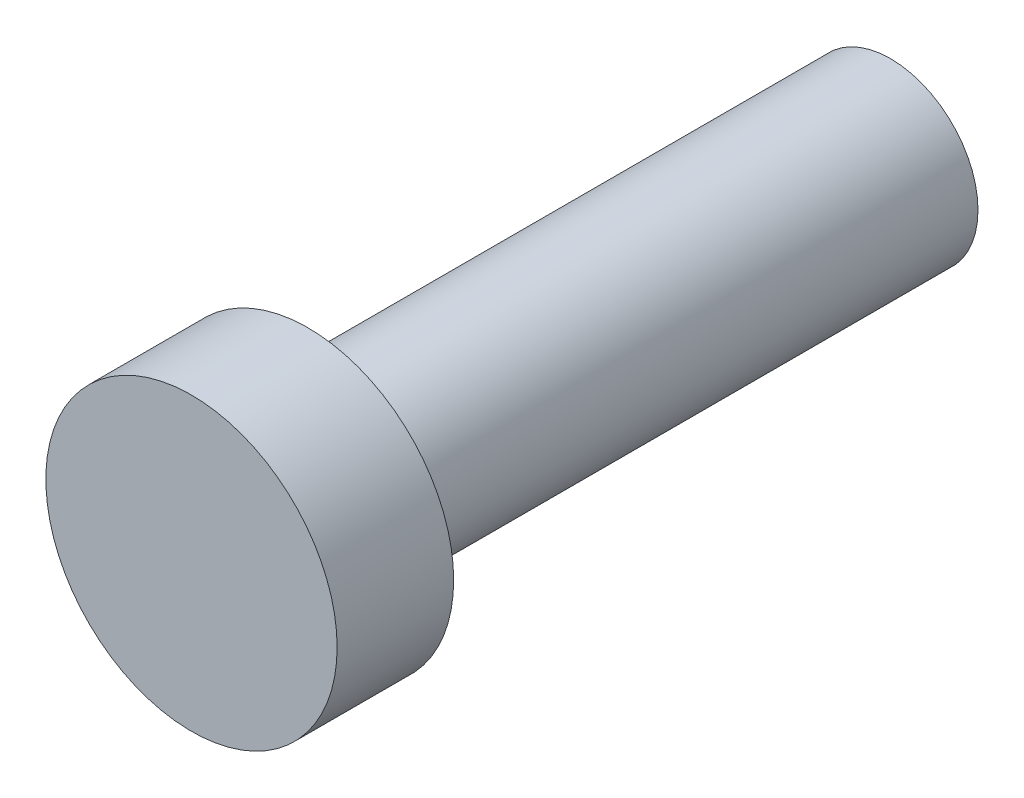
ISO-10303-21;
HEADER;
FILE_DESCRIPTION(('STEP AP214'),'2;1');
FILE_NAME('part.step','',(''),(''),'','','');
FILE_SCHEMA(('AUTOMOTIVE_DESIGN { 1 0 10303 214 1 1 1 1 }'));
ENDSEC;
DATA;
#1=APPLICATION_CONTEXT('core data for automotive mechanical design processes');
#2=APPLICATION_PROTOCOL_DEFINITION('international standard','automotive_design',2000,#1);
#3=PRODUCT_CONTEXT('',#1,'mechanical');
#4=PRODUCT('Part','Part','',(#3));
#5=PRODUCT_RELATED_PRODUCT_CATEGORY('part','',(#4));
#6=PRODUCT_DEFINITION_FORMATION('','',#4);
#7=PRODUCT_DEFINITION_CONTEXT('part definition',#1,'design');
#8=PRODUCT_DEFINITION('design','',#6,#7);
#9=PRODUCT_DEFINITION_SHAPE('','',#8);
#10=(LENGTH_UNIT() NAMED_UNIT(*) SI_UNIT(.MILLI.,.METRE.));
#11=(NAMED_UNIT(*) PLANE_ANGLE_UNIT() SI_UNIT($,.RADIAN.));
#12=(NAMED_UNIT(*) SI_UNIT($,.STERADIAN.) SOLID_ANGLE_UNIT());
#13=UNCERTAINTY_MEASURE_WITH_UNIT(LENGTH_MEASURE(1.E-05),#10,'distance_accuracy_value','');
#14=(GEOMETRIC_REPRESENTATION_CONTEXT(3) GLOBAL_UNCERTAINTY_ASSIGNED_CONTEXT((#13)) GLOBAL_UNIT_ASSIGNED_CONTEXT((#10,
#11,#12)) REPRESENTATION_CONTEXT('',''));
#15=CARTESIAN_POINT('',(0.,0.,0.));
#16=DIRECTION('',(0.,0.,1.));
#17=DIRECTION('',(1.,0.,0.));
#18=AXIS2_PLACEMENT_3D('',#15,#16,#17);
#19=CARTESIAN_POINT('',(0.,0.,-10.));
#20=DIRECTION('',(0.,0.,1.));
#21=DIRECTION('',(1.,0.,0.));
#22=AXIS2_PLACEMENT_3D('',#19,#20,#21);
#23=CYLINDRICAL_SURFACE('',#22,1.5);
#24=CARTESIAN_POINT('',(0.,0.,-10.));
#25=DIRECTION('',(0.,0.,1.));
#26=DIRECTION('',(1.,0.,0.));
#27=AXIS2_PLACEMENT_3D('',#24,#25,#26);
#28=CIRCLE('',#27,1.5);
#29=CARTESIAN_POINT('',(1.5,0.,-10.));
#30=VERTEX_POINT('',#29);
#31=EDGE_CURVE('E10',#30,#30,#28,.T.);
#32=ORIENTED_EDGE('',*,*,#31,.T.);
#33=EDGE_LOOP('',(#32));
#34=FACE_BOUND('',#33,.T.);
#35=CARTESIAN_POINT('',(0.,0.,0.));
#36=DIRECTION('',(0.,0.,1.));
#37=DIRECTION('',(1.,0.,0.));
#38=AXIS2_PLACEMENT_3D('',#35,#36,#37);
#39=CIRCLE('',#38,1.5);
#40=CARTESIAN_POINT('',(1.5,0.,0.));
#41=VERTEX_POINT('',#40);
#42=EDGE_CURVE('E44',#41,#41,#39,.T.);
#43=ORIENTED_EDGE('',*,*,#42,.F.);
#44=EDGE_LOOP('',(#43));
#45=FACE_BOUND('',#44,.T.);
#46=ADVANCED_FACE('F41',(#34,#45),#23,.T.);
#47=CARTESIAN_POINT('',(0.,0.,-10.));
#48=DIRECTION('',(0.,0.,1.));
#49=DIRECTION('',(1.,0.,0.));
#50=AXIS2_PLACEMENT_3D('',#47,#48,#49);
#51=PLANE('',#50);
#52=ORIENTED_EDGE('',*,*,#31,.F.);
#53=EDGE_LOOP('',(#52));
#54=FACE_BOUND('',#53,.T.);
#55=ADVANCED_FACE('F68',(#54),#51,.F.);
#56=CARTESIAN_POINT('',(0.,0.,2.));
#57=DIRECTION('',(0.,0.,-1.));
#58=DIRECTION('',(-1.,0.,0.));
#59=AXIS2_PLACEMENT_3D('',#56,#57,#58);
#60=CYLINDRICAL_SURFACE('',#59,2.5);
#61=CARTESIAN_POINT('',(0.,0.,2.));
#62=DIRECTION('',(0.,0.,1.));
#63=DIRECTION('',(1.,0.,0.));
#64=AXIS2_PLACEMENT_3D('',#61,#62,#63);
#65=CIRCLE('',#64,2.5);
#66=CARTESIAN_POINT('',(2.5,0.,2.));
#67=VERTEX_POINT('',#66);
#68=EDGE_CURVE('E53',#67,#67,#65,.T.);
#69=ORIENTED_EDGE('',*,*,#68,.F.);
#70=EDGE_LOOP('',(#69));
#71=FACE_BOUND('',#70,.T.);
#72=CARTESIAN_POINT('',(0.,0.,0.));
#73=DIRECTION('',(0.,0.,1.));
#74=DIRECTION('',(1.,0.,0.));
#75=AXIS2_PLACEMENT_3D('',#72,#73,#74);
#76=CIRCLE('',#75,2.5);
#77=CARTESIAN_POINT('',(2.5,0.,0.));
#78=VERTEX_POINT('',#77);
#79=EDGE_CURVE('E55',#78,#78,#76,.T.);
#80=ORIENTED_EDGE('',*,*,#79,.T.);
#81=EDGE_LOOP('',(#80));
#82=FACE_BOUND('',#81,.T.);
#83=ADVANCED_FACE('F65',(#71,#82),#60,.T.);
#84=CARTESIAN_POINT('',(0.,0.,2.));
#85=DIRECTION('',(0.,0.,1.));
#86=DIRECTION('',(1.,0.,0.));
#87=AXIS2_PLACEMENT_3D('',#84,#85,#86);
#88=PLANE('',#87);
#89=ORIENTED_EDGE('',*,*,#68,.T.);
#90=EDGE_LOOP('',(#89));
#91=FACE_BOUND('',#90,.T.);
#92=ADVANCED_FACE('F63',(#91),#88,.T.);
#93=CARTESIAN_POINT('',(0.,0.,0.));
#94=DIRECTION('',(0.,0.,1.));
#95=DIRECTION('',(1.,0.,0.));
#96=AXIS2_PLACEMENT_3D('',#93,#94,#95);
#97=PLANE('',#96);
#98=ORIENTED_EDGE('',*,*,#42,.T.);
#99=EDGE_LOOP('',(#98));
#100=FACE_BOUND('',#99,.T.);
#101=ORIENTED_EDGE('',*,*,#79,.F.);
#102=EDGE_LOOP('',(#101));
#103=FACE_BOUND('',#102,.T.);
#104=ADVANCED_FACE('F72',(#100,#103),#97,.F.);
#105=CLOSED_SHELL('',(#46,#55,#83,#92,#104));
#106=MANIFOLD_SOLID_BREP('B2',#105);
#107=ADVANCED_BREP_SHAPE_REPRESENTATION('',(#18,#106),#14);
#108=SHAPE_DEFINITION_REPRESENTATION(#9,#107);
ENDSEC;
END-ISO-10303-21;
